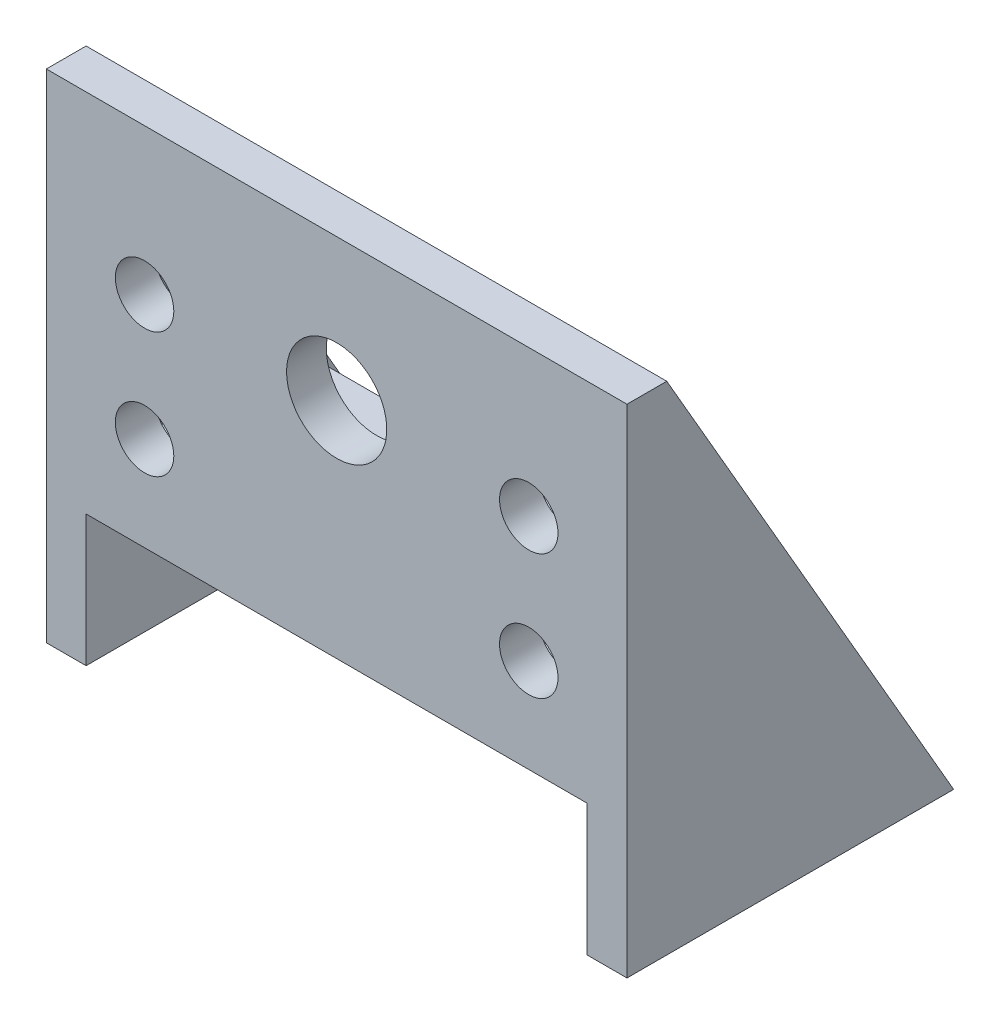
ISO-10303-21;
HEADER;
FILE_DESCRIPTION(('STEP AP214'),'2;1');
FILE_NAME('part.step','',(''),(''),'','','');
FILE_SCHEMA(('AUTOMOTIVE_DESIGN { 1 0 10303 214 1 1 1 1 }'));
ENDSEC;
DATA;
#1=APPLICATION_CONTEXT('core data for automotive mechanical design processes');
#2=APPLICATION_PROTOCOL_DEFINITION('international standard','automotive_design',2000,#1);
#3=PRODUCT_CONTEXT('',#1,'mechanical');
#4=PRODUCT('Part','Part','',(#3));
#5=PRODUCT_RELATED_PRODUCT_CATEGORY('part','',(#4));
#6=PRODUCT_DEFINITION_FORMATION('','',#4);
#7=PRODUCT_DEFINITION_CONTEXT('part definition',#1,'design');
#8=PRODUCT_DEFINITION('design','',#6,#7);
#9=PRODUCT_DEFINITION_SHAPE('','',#8);
#10=(LENGTH_UNIT() NAMED_UNIT(*) SI_UNIT(.MILLI.,.METRE.));
#11=(NAMED_UNIT(*) PLANE_ANGLE_UNIT() SI_UNIT($,.RADIAN.));
#12=(NAMED_UNIT(*) SI_UNIT($,.STERADIAN.) SOLID_ANGLE_UNIT());
#13=UNCERTAINTY_MEASURE_WITH_UNIT(LENGTH_MEASURE(1.E-05),#10,'distance_accuracy_value','');
#14=(GEOMETRIC_REPRESENTATION_CONTEXT(3) GLOBAL_UNCERTAINTY_ASSIGNED_CONTEXT((#13)) GLOBAL_UNIT_ASSIGNED_CONTEXT((#10,
#11,#12)) REPRESENTATION_CONTEXT('',''));
#15=CARTESIAN_POINT('',(0.,0.,0.));
#16=DIRECTION('',(0.,0.,1.));
#17=DIRECTION('',(1.,0.,0.));
#18=AXIS2_PLACEMENT_3D('',#15,#16,#17);
#19=CARTESIAN_POINT('',(0.,0.,4.7625));
#20=DIRECTION('',(0.,0.,1.));
#21=DIRECTION('',(1.,0.,0.));
#22=AXIS2_PLACEMENT_3D('',#19,#20,#21);
#23=PLANE('',#22);
#24=CARTESIAN_POINT('',(-30.7093483331857,-24.4339622641509,4.7625));
#25=DIRECTION('',(0.,0.,1.));
#26=DIRECTION('',(1.,0.,0.));
#27=AXIS2_PLACEMENT_3D('',#24,#25,#26);
#28=CIRCLE('',#27,3.5);
#29=CARTESIAN_POINT('',(-27.2093483331857,-24.4339622641509,4.7625));
#30=VERTEX_POINT('',#29);
#31=EDGE_CURVE('E375',#30,#30,#28,.T.);
#32=ORIENTED_EDGE('',*,*,#31,.F.);
#33=EDGE_LOOP('',(#32));
#34=FACE_BOUND('',#33,.T.);
#35=CARTESIAN_POINT('',(15.2906516668143,-24.4339622641509,4.7625));
#36=DIRECTION('',(0.,0.,1.));
#37=DIRECTION('',(1.,0.,0.));
#38=AXIS2_PLACEMENT_3D('',#35,#36,#37);
#39=CIRCLE('',#38,3.5);
#40=CARTESIAN_POINT('',(18.7906516668143,-24.4339622641509,4.7625));
#41=VERTEX_POINT('',#40);
#42=EDGE_CURVE('E379',#41,#41,#39,.T.);
#43=ORIENTED_EDGE('',*,*,#42,.F.);
#44=EDGE_LOOP('',(#43));
#45=FACE_BOUND('',#44,.T.);
#46=CARTESIAN_POINT('',(15.2906516668143,-9.43396226415094,4.7625));
#47=DIRECTION('',(0.,0.,1.));
#48=DIRECTION('',(1.,0.,0.));
#49=AXIS2_PLACEMENT_3D('',#46,#47,#48);
#50=CIRCLE('',#49,3.5);
#51=CARTESIAN_POINT('',(18.7906516668143,-9.43396226415094,4.7625));
#52=VERTEX_POINT('',#51);
#53=EDGE_CURVE('E374',#52,#52,#50,.T.);
#54=ORIENTED_EDGE('',*,*,#53,.F.);
#55=EDGE_LOOP('',(#54));
#56=FACE_BOUND('',#55,.T.);
#57=CARTESIAN_POINT('',(-30.7093483331857,-9.43396226415094,4.7625));
#58=DIRECTION('',(0.,0.,1.));
#59=DIRECTION('',(1.,0.,0.));
#60=AXIS2_PLACEMENT_3D('',#57,#58,#59);
#61=CIRCLE('',#60,3.5);
#62=CARTESIAN_POINT('',(-27.2093483331857,-9.43396226415094,4.7625));
#63=VERTEX_POINT('',#62);
#64=EDGE_CURVE('E262',#63,#63,#61,.T.);
#65=ORIENTED_EDGE('',*,*,#64,.F.);
#66=EDGE_LOOP('',(#65));
#67=FACE_BOUND('',#66,.T.);
#68=DIRECTION('',(1.,0.,0.));
#69=VECTOR('',#68,1.);
#70=CARTESIAN_POINT('',(-37.7093483331857,-35.6964622641509,4.7625));
#71=LINE('',#70,#69);
#72=CARTESIAN_POINT('',(-37.7093483331857,-35.6964622641509,4.7625));
#73=VERTEX_POINT('',#72);
#74=CARTESIAN_POINT('',(22.2906516668143,-35.6964622641509,4.7625));
#75=VERTEX_POINT('',#74);
#76=EDGE_CURVE('E130',#73,#75,#71,.T.);
#77=ORIENTED_EDGE('',*,*,#76,.T.);
#78=DIRECTION('',(0.,-1.,0.));
#79=VECTOR('',#78,1.);
#80=CARTESIAN_POINT('',(22.2906516668143,8.06603773584906,4.7625));
#81=LINE('',#80,#79);
#82=CARTESIAN_POINT('',(22.2906516668143,-51.4339622641509,4.7625));
#83=VERTEX_POINT('',#82);
#84=EDGE_CURVE('E195',#75,#83,#81,.T.);
#85=ORIENTED_EDGE('',*,*,#84,.T.);
#86=DIRECTION('',(-1.,0.,0.));
#87=VECTOR('',#86,1.);
#88=CARTESIAN_POINT('',(27.0531516668143,-51.4339622641509,4.7625));
#89=LINE('',#88,#87);
#90=CARTESIAN_POINT('',(27.0531516668143,-51.4339622641509,4.7625));
#91=VERTEX_POINT('',#90);
#92=EDGE_CURVE('E231',#91,#83,#89,.T.);
#93=ORIENTED_EDGE('',*,*,#92,.F.);
#94=DIRECTION('',(0.,-1.,0.));
#95=VECTOR('',#94,1.);
#96=CARTESIAN_POINT('',(27.0531516668143,8.06603773584906,4.7625));
#97=LINE('',#96,#95);
#98=CARTESIAN_POINT('',(27.0531516668143,8.06603773584906,4.7625));
#99=VERTEX_POINT('',#98);
#100=EDGE_CURVE('E205',#99,#91,#97,.T.);
#101=ORIENTED_EDGE('',*,*,#100,.F.);
#102=DIRECTION('',(-1.,0.,0.));
#103=VECTOR('',#102,1.);
#104=CARTESIAN_POINT('',(-37.7093483331857,8.06603773584906,4.7625));
#105=LINE('',#104,#103);
#106=CARTESIAN_POINT('',(-42.4718483331857,8.06603773584906,4.7625));
#107=VERTEX_POINT('',#106);
#108=EDGE_CURVE('E11',#99,#107,#105,.T.);
#109=ORIENTED_EDGE('',*,*,#108,.T.);
#110=DIRECTION('',(0.,-1.,0.));
#111=VECTOR('',#110,1.);
#112=CARTESIAN_POINT('',(-42.4718483331857,8.06603773584906,4.7625));
#113=LINE('',#112,#111);
#114=CARTESIAN_POINT('',(-42.4718483331857,-51.4339622641509,4.7625));
#115=VERTEX_POINT('',#114);
#116=EDGE_CURVE('E171',#107,#115,#113,.T.);
#117=ORIENTED_EDGE('',*,*,#116,.T.);
#118=DIRECTION('',(1.,0.,0.));
#119=VECTOR('',#118,1.);
#120=CARTESIAN_POINT('',(-42.4718483331857,-51.4339622641509,4.7625));
#121=LINE('',#120,#119);
#122=CARTESIAN_POINT('',(-37.7093483331857,-51.4339622641509,4.7625));
#123=VERTEX_POINT('',#122);
#124=EDGE_CURVE('E132',#115,#123,#121,.T.);
#125=ORIENTED_EDGE('',*,*,#124,.T.);
#126=DIRECTION('',(0.,-1.,0.));
#127=VECTOR('',#126,1.);
#128=CARTESIAN_POINT('',(-37.7093483331857,8.06603773584906,4.7625));
#129=LINE('',#128,#127);
#130=EDGE_CURVE('E126',#73,#123,#129,.T.);
#131=ORIENTED_EDGE('',*,*,#130,.F.);
#132=EDGE_LOOP('',(#77,#85,#93,#101,#109,#117,#125,#131));
#133=FACE_BOUND('',#132,.T.);
#134=CARTESIAN_POINT('',(-7.70934833318569,-8.93396226415094,4.7625));
#135=DIRECTION('',(0.,0.,1.));
#136=DIRECTION('',(1.,0.,0.));
#137=AXIS2_PLACEMENT_3D('',#134,#135,#136);
#138=CIRCLE('',#137,6.);
#139=CARTESIAN_POINT('',(-13.7093483331857,-8.93396226415094,4.7625));
#140=VERTEX_POINT('',#139);
#141=EDGE_CURVE('E236',#140,#140,#138,.T.);
#142=ORIENTED_EDGE('',*,*,#141,.F.);
#143=EDGE_LOOP('',(#142));
#144=FACE_BOUND('',#143,.T.);
#145=ADVANCED_FACE('F43',(#34,#45,#56,#67,#133,#144),#23,.T.);
#146=CARTESIAN_POINT('',(0.,0.,0.));
#147=DIRECTION('',(0.,0.,1.));
#148=DIRECTION('',(1.,0.,0.));
#149=AXIS2_PLACEMENT_3D('',#146,#147,#148);
#150=PLANE('',#149);
#151=CARTESIAN_POINT('',(-30.7093483331857,-24.4339622641509,0.));
#152=DIRECTION('',(0.,0.,1.));
#153=DIRECTION('',(1.,0.,0.));
#154=AXIS2_PLACEMENT_3D('',#151,#152,#153);
#155=CIRCLE('',#154,3.5);
#156=CARTESIAN_POINT('',(-27.2093483331857,-24.4339622641509,0.));
#157=VERTEX_POINT('',#156);
#158=EDGE_CURVE('E47',#157,#157,#155,.T.);
#159=ORIENTED_EDGE('',*,*,#158,.T.);
#160=EDGE_LOOP('',(#159));
#161=FACE_BOUND('',#160,.T.);
#162=CARTESIAN_POINT('',(15.2906516668143,-24.4339622641509,0.));
#163=DIRECTION('',(0.,0.,1.));
#164=DIRECTION('',(1.,0.,0.));
#165=AXIS2_PLACEMENT_3D('',#162,#163,#164);
#166=CIRCLE('',#165,3.5);
#167=CARTESIAN_POINT('',(18.7906516668143,-24.4339622641509,0.));
#168=VERTEX_POINT('',#167);
#169=EDGE_CURVE('E159',#168,#168,#166,.T.);
#170=ORIENTED_EDGE('',*,*,#169,.T.);
#171=EDGE_LOOP('',(#170));
#172=FACE_BOUND('',#171,.T.);
#173=CARTESIAN_POINT('',(15.2906516668143,-9.43396226415094,0.));
#174=DIRECTION('',(0.,0.,1.));
#175=DIRECTION('',(1.,0.,0.));
#176=AXIS2_PLACEMENT_3D('',#173,#174,#175);
#177=CIRCLE('',#176,3.5);
#178=CARTESIAN_POINT('',(18.7906516668143,-9.43396226415094,0.));
#179=VERTEX_POINT('',#178);
#180=EDGE_CURVE('E261',#179,#179,#177,.T.);
#181=ORIENTED_EDGE('',*,*,#180,.T.);
#182=EDGE_LOOP('',(#181));
#183=FACE_BOUND('',#182,.T.);
#184=CARTESIAN_POINT('',(-30.7093483331857,-9.43396226415094,0.));
#185=DIRECTION('',(0.,0.,1.));
#186=DIRECTION('',(1.,0.,0.));
#187=AXIS2_PLACEMENT_3D('',#184,#185,#186);
#188=CIRCLE('',#187,3.5);
#189=CARTESIAN_POINT('',(-27.2093483331857,-9.43396226415094,0.));
#190=VERTEX_POINT('',#189);
#191=EDGE_CURVE('E257',#190,#190,#188,.T.);
#192=ORIENTED_EDGE('',*,*,#191,.T.);
#193=EDGE_LOOP('',(#192));
#194=FACE_BOUND('',#193,.T.);
#195=DIRECTION('',(0.,-1.,0.));
#196=VECTOR('',#195,1.);
#197=CARTESIAN_POINT('',(-37.7093483331857,8.06603773584906,0.));
#198=LINE('',#197,#196);
#199=CARTESIAN_POINT('',(-37.7093483331857,8.06603773584906,0.));
#200=VERTEX_POINT('',#199);
#201=CARTESIAN_POINT('',(-37.7093483331857,-30.9339622641509,0.));
#202=VERTEX_POINT('',#201);
#203=EDGE_CURVE('E240',#200,#202,#198,.T.);
#204=ORIENTED_EDGE('',*,*,#203,.F.);
#205=DIRECTION('',(-1.,0.,0.));
#206=VECTOR('',#205,1.);
#207=CARTESIAN_POINT('',(-37.7093483331857,8.06603773584906,0.));
#208=LINE('',#207,#206);
#209=CARTESIAN_POINT('',(22.2906516668143,8.06603773584906,0.));
#210=VERTEX_POINT('',#209);
#211=EDGE_CURVE('E53',#210,#200,#208,.T.);
#212=ORIENTED_EDGE('',*,*,#211,.F.);
#213=DIRECTION('',(0.,1.,0.));
#214=VECTOR('',#213,1.);
#215=CARTESIAN_POINT('',(22.2906516668143,8.06603773584906,0.));
#216=LINE('',#215,#214);
#217=CARTESIAN_POINT('',(22.2906516668143,-30.9339622641509,0.));
#218=VERTEX_POINT('',#217);
#219=EDGE_CURVE('E250',#218,#210,#216,.T.);
#220=ORIENTED_EDGE('',*,*,#219,.F.);
#221=DIRECTION('',(1.,0.,0.));
#222=VECTOR('',#221,1.);
#223=CARTESIAN_POINT('',(-37.7093483331857,-30.9339622641509,0.));
#224=LINE('',#223,#222);
#225=EDGE_CURVE('E246',#202,#218,#224,.T.);
#226=ORIENTED_EDGE('',*,*,#225,.F.);
#227=EDGE_LOOP('',(#204,#212,#220,#226));
#228=FACE_BOUND('',#227,.T.);
#229=CARTESIAN_POINT('',(-7.70934833318569,-8.93396226415094,0.));
#230=DIRECTION('',(0.,0.,1.));
#231=DIRECTION('',(1.,0.,0.));
#232=AXIS2_PLACEMENT_3D('',#229,#230,#231);
#233=CIRCLE('',#232,6.);
#234=CARTESIAN_POINT('',(-13.7093483331857,-8.93396226415094,0.));
#235=VERTEX_POINT('',#234);
#236=EDGE_CURVE('E235',#235,#235,#233,.T.);
#237=ORIENTED_EDGE('',*,*,#236,.T.);
#238=EDGE_LOOP('',(#237));
#239=FACE_BOUND('',#238,.T.);
#240=ADVANCED_FACE('F269',(#161,#172,#183,#194,#228,#239),#150,.F.);
#241=CARTESIAN_POINT('',(-37.7093483331857,8.06603773584906,4.7625));
#242=DIRECTION('',(0.,-1.,0.));
#243=DIRECTION('',(0.,0.,-1.));
#244=AXIS2_PLACEMENT_3D('',#241,#242,#243);
#245=PLANE('',#244);
#246=ORIENTED_EDGE('',*,*,#211,.T.);
#247=DIRECTION('',(1.,0.,0.));
#248=VECTOR('',#247,1.);
#249=CARTESIAN_POINT('',(-42.4718483331857,8.06603773584906,0.));
#250=LINE('',#249,#248);
#251=CARTESIAN_POINT('',(-42.4718483331857,8.06603773584906,0.));
#252=VERTEX_POINT('',#251);
#253=EDGE_CURVE('E192',#252,#200,#250,.T.);
#254=ORIENTED_EDGE('',*,*,#253,.F.);
#255=DIRECTION('',(0.,0.,1.));
#256=VECTOR('',#255,1.);
#257=CARTESIAN_POINT('',(-42.4718483331857,8.06603773584906,4.7625));
#258=LINE('',#257,#256);
#259=EDGE_CURVE('E183',#252,#107,#258,.T.);
#260=ORIENTED_EDGE('',*,*,#259,.T.);
#261=ORIENTED_EDGE('',*,*,#108,.F.);
#262=DIRECTION('',(0.,0.,1.));
#263=VECTOR('',#262,1.);
#264=CARTESIAN_POINT('',(27.0531516668143,8.06603773584906,0.));
#265=LINE('',#264,#263);
#266=CARTESIAN_POINT('',(27.0531516668143,8.06603773584906,0.));
#267=VERTEX_POINT('',#266);
#268=EDGE_CURVE('E201',#267,#99,#265,.T.);
#269=ORIENTED_EDGE('',*,*,#268,.F.);
#270=DIRECTION('',(-1.,0.,0.));
#271=VECTOR('',#270,1.);
#272=CARTESIAN_POINT('',(27.0531516668143,8.06603773584906,0.));
#273=LINE('',#272,#271);
#274=EDGE_CURVE('E215',#267,#210,#273,.T.);
#275=ORIENTED_EDGE('',*,*,#274,.T.);
#276=EDGE_LOOP('',(#246,#254,#260,#261,#269,#275));
#277=FACE_BOUND('',#276,.T.);
#278=ADVANCED_FACE('F45',(#277),#245,.F.);
#279=CARTESIAN_POINT('',(-7.70934833318569,-8.93396226415094,4.7625));
#280=DIRECTION('',(0.,0.,-1.));
#281=DIRECTION('',(-1.,0.,0.));
#282=AXIS2_PLACEMENT_3D('',#279,#280,#281);
#283=CYLINDRICAL_SURFACE('',#282,6.);
#284=CARTESIAN_POINT('',(-13.7093483331857,-8.93396226415094,4.7625));
#285=CARTESIAN_POINT('',(-13.7093483331857,-8.93396226415094,4.712890625));
#286=CARTESIAN_POINT('',(-13.7093483331857,-8.93396226415094,4.66328125));
#287=CARTESIAN_POINT('',(-13.7093483331857,-8.93396226415094,4.5640625));
#288=CARTESIAN_POINT('',(-13.7093483331857,-8.93396226415094,4.514453125));
#289=CARTESIAN_POINT('',(-13.7093483331857,-8.93396226415094,4.415234375));
#290=CARTESIAN_POINT('',(-13.7093483331857,-8.93396226415094,4.365625));
#291=CARTESIAN_POINT('',(-13.7093483331857,-8.93396226415094,4.26640625));
#292=CARTESIAN_POINT('',(-13.7093483331857,-8.93396226415094,4.216796875));
#293=CARTESIAN_POINT('',(-13.7093483331857,-8.93396226415094,4.117578125));
#294=CARTESIAN_POINT('',(-13.7093483331857,-8.93396226415094,4.06796875));
#295=CARTESIAN_POINT('',(-13.7093483331857,-8.93396226415094,3.96875));
#296=CARTESIAN_POINT('',(-13.7093483331857,-8.93396226415094,3.919140625));
#297=CARTESIAN_POINT('',(-13.7093483331857,-8.93396226415094,3.819921875));
#298=CARTESIAN_POINT('',(-13.7093483331857,-8.93396226415094,3.7703125));
#299=CARTESIAN_POINT('',(-13.7093483331857,-8.93396226415094,3.67109375));
#300=CARTESIAN_POINT('',(-13.7093483331857,-8.93396226415094,3.621484375));
#301=CARTESIAN_POINT('',(-13.7093483331857,-8.93396226415094,3.522265625));
#302=CARTESIAN_POINT('',(-13.7093483331857,-8.93396226415094,3.47265625));
#303=CARTESIAN_POINT('',(-13.7093483331857,-8.93396226415094,3.3734375));
#304=CARTESIAN_POINT('',(-13.7093483331857,-8.93396226415094,3.323828125));
#305=CARTESIAN_POINT('',(-13.7093483331857,-8.93396226415094,3.224609375));
#306=CARTESIAN_POINT('',(-13.7093483331857,-8.93396226415094,3.175));
#307=CARTESIAN_POINT('',(-13.7093483331857,-8.93396226415094,3.07578125));
#308=CARTESIAN_POINT('',(-13.7093483331857,-8.93396226415094,3.026171875));
#309=CARTESIAN_POINT('',(-13.7093483331857,-8.93396226415094,2.926953125));
#310=CARTESIAN_POINT('',(-13.7093483331857,-8.93396226415094,2.87734375));
#311=CARTESIAN_POINT('',(-13.7093483331857,-8.93396226415094,2.778125));
#312=CARTESIAN_POINT('',(-13.7093483331857,-8.93396226415094,2.728515625));
#313=CARTESIAN_POINT('',(-13.7093483331857,-8.93396226415094,2.629296875));
#314=CARTESIAN_POINT('',(-13.7093483331857,-8.93396226415094,2.5796875));
#315=CARTESIAN_POINT('',(-13.7093483331857,-8.93396226415094,2.48046875));
#316=CARTESIAN_POINT('',(-13.7093483331857,-8.93396226415094,2.430859375));
#317=CARTESIAN_POINT('',(-13.7093483331857,-8.93396226415094,2.331640625));
#318=CARTESIAN_POINT('',(-13.7093483331857,-8.93396226415094,2.28203125));
#319=CARTESIAN_POINT('',(-13.7093483331857,-8.93396226415094,2.1828125));
#320=CARTESIAN_POINT('',(-13.7093483331857,-8.93396226415094,2.133203125));
#321=CARTESIAN_POINT('',(-13.7093483331857,-8.93396226415094,2.033984375));
#322=CARTESIAN_POINT('',(-13.7093483331857,-8.93396226415094,1.984375));
#323=CARTESIAN_POINT('',(-13.7093483331857,-8.93396226415094,1.88515625));
#324=CARTESIAN_POINT('',(-13.7093483331857,-8.93396226415094,1.835546875));
#325=CARTESIAN_POINT('',(-13.7093483331857,-8.93396226415094,1.736328125));
#326=CARTESIAN_POINT('',(-13.7093483331857,-8.93396226415094,1.68671875));
#327=CARTESIAN_POINT('',(-13.7093483331857,-8.93396226415094,1.5875));
#328=CARTESIAN_POINT('',(-13.7093483331857,-8.93396226415094,1.537890625));
#329=CARTESIAN_POINT('',(-13.7093483331857,-8.93396226415094,1.438671875));
#330=CARTESIAN_POINT('',(-13.7093483331857,-8.93396226415094,1.3890625));
#331=CARTESIAN_POINT('',(-13.7093483331857,-8.93396226415094,1.28984375));
#332=CARTESIAN_POINT('',(-13.7093483331857,-8.93396226415094,1.240234375));
#333=CARTESIAN_POINT('',(-13.7093483331857,-8.93396226415094,1.141015625));
#334=CARTESIAN_POINT('',(-13.7093483331857,-8.93396226415094,1.09140625));
#335=CARTESIAN_POINT('',(-13.7093483331857,-8.93396226415094,0.992187499999999));
#336=CARTESIAN_POINT('',(-13.7093483331857,-8.93396226415094,0.942578124999999));
#337=CARTESIAN_POINT('',(-13.7093483331857,-8.93396226415094,0.843359375));
#338=CARTESIAN_POINT('',(-13.7093483331857,-8.93396226415094,0.79375));
#339=CARTESIAN_POINT('',(-13.7093483331857,-8.93396226415094,0.69453125));
#340=CARTESIAN_POINT('',(-13.7093483331857,-8.93396226415094,0.644921875));
#341=CARTESIAN_POINT('',(-13.7093483331857,-8.93396226415094,0.545703125));
#342=CARTESIAN_POINT('',(-13.7093483331857,-8.93396226415094,0.49609375));
#343=CARTESIAN_POINT('',(-13.7093483331857,-8.93396226415094,0.396875));
#344=CARTESIAN_POINT('',(-13.7093483331857,-8.93396226415094,0.347265625));
#345=CARTESIAN_POINT('',(-13.7093483331857,-8.93396226415094,0.248046875));
#346=CARTESIAN_POINT('',(-13.7093483331857,-8.93396226415094,0.1984375));
#347=CARTESIAN_POINT('',(-13.7093483331857,-8.93396226415094,0.09921875));
#348=CARTESIAN_POINT('',(-13.7093483331857,-8.93396226415094,0.049609375));
#349=CARTESIAN_POINT('',(-13.7093483331857,-8.93396226415094,0.));
#350=B_SPLINE_CURVE_WITH_KNOTS('',3,(#284,#285,#286,#287,#288,#289,#290,#291,#292,#293,#294,
#295,#296,#297,#298,#299,#300,#301,#302,#303,#304,#305,#306,#307,#308,#309,#310,#311,#312,#313,
#314,#315,#316,#317,#318,#319,#320,#321,#322,#323,#324,#325,#326,#327,#328,#329,#330,#331,#332,
#333,#334,#335,#336,#337,#338,#339,#340,#341,#342,#343,#344,#345,#346,#347,#348,#349),
.UNSPECIFIED.,.F.,.F.,(4,2,2,2,2,2,2,2,2,2,2,2,2,2,2,2,2,2,2,2,2,2,2,2,2,2,2,2,2,2,2,2,4),(0.,
0.148828125,0.29765625,0.446484375,0.5953125,0.744140625,0.892968750000001,1.041796875,1.190625,
1.339453125,1.48828125,1.637109375,1.7859375,1.934765625,2.08359375,2.232421875,2.38125,
2.530078125,2.67890625,2.827734375,2.9765625,3.125390625,3.27421875,3.423046875,3.571875,
3.720703125,3.86953125,4.018359375,4.1671875,4.316015625,4.46484375,4.613671875,4.7625),.UNSPECIFIED.);
#351=EDGE_CURVE('BSEAM298',#140,#235,#350,.T.);
#352=ORIENTED_EDGE('',*,*,#141,.T.);
#353=ORIENTED_EDGE('',*,*,#236,.F.);
#354=ORIENTED_EDGE('',*,*,#351,.T.);
#355=ORIENTED_EDGE('',*,*,#351,.F.);
#356=EDGE_LOOP('',(#352,#354,#353,#355));
#357=FACE_BOUND('',#356,.T.);
#358=ADVANCED_FACE('F298',(#357),#283,.F.);
#359=CARTESIAN_POINT('',(22.2906516668143,0.,0.));
#360=DIRECTION('',(1.,0.,0.));
#361=DIRECTION('',(0.,0.,-1.));
#362=AXIS2_PLACEMENT_3D('',#359,#360,#361);
#363=PLANE('',#362);
#364=DIRECTION('',(0.,1.,0.));
#365=VECTOR('',#364,1.);
#366=CARTESIAN_POINT('',(22.2906516668143,-30.9339622641509,-20.2375));
#367=LINE('',#366,#365);
#368=CARTESIAN_POINT('',(22.2906516668143,-35.6964622641509,-20.2375));
#369=VERTEX_POINT('',#368);
#370=CARTESIAN_POINT('',(22.2906516668143,-30.9339622641509,-20.2375));
#371=VERTEX_POINT('',#370);
#372=EDGE_CURVE('E65',#369,#371,#367,.T.);
#373=ORIENTED_EDGE('',*,*,#372,.T.);
#374=DIRECTION('',(0.,0.,1.));
#375=VECTOR('',#374,1.);
#376=CARTESIAN_POINT('',(22.2906516668143,-30.9339622641509,-20.2375));
#377=LINE('',#376,#375);
#378=EDGE_CURVE('E166',#371,#218,#377,.T.);
#379=ORIENTED_EDGE('',*,*,#378,.T.);
#380=ORIENTED_EDGE('',*,*,#219,.T.);
#381=DIRECTION('',(0.,0.866025403784436,0.500000000000004));
#382=VECTOR('',#381,1.);
#383=CARTESIAN_POINT('',(22.2906516668143,-51.4339622641509,-34.3523410167831));
#384=LINE('',#383,#382);
#385=CARTESIAN_POINT('',(22.2906516668143,-51.4339622641509,-34.3523410167831));
#386=VERTEX_POINT('',#385);
#387=EDGE_CURVE('E206',#386,#210,#384,.T.);
#388=ORIENTED_EDGE('',*,*,#387,.F.);
#389=DIRECTION('',(0.,0.,-1.));
#390=VECTOR('',#389,1.);
#391=CARTESIAN_POINT('',(22.2906516668143,-51.4339622641509,4.7625));
#392=LINE('',#391,#390);
#393=EDGE_CURVE('E218',#83,#386,#392,.T.);
#394=ORIENTED_EDGE('',*,*,#393,.F.);
#395=ORIENTED_EDGE('',*,*,#84,.F.);
#396=DIRECTION('',(0.,0.,1.));
#397=VECTOR('',#396,1.);
#398=CARTESIAN_POINT('',(22.2906516668143,-35.6964622641509,-20.2375));
#399=LINE('',#398,#397);
#400=EDGE_CURVE('E61',#369,#75,#399,.T.);
#401=ORIENTED_EDGE('',*,*,#400,.F.);
#402=EDGE_LOOP('',(#373,#379,#380,#388,#394,#395,#401));
#403=FACE_BOUND('',#402,.T.);
#404=ADVANCED_FACE('F301',(#403),#363,.F.);
#405=CARTESIAN_POINT('',(27.0531516668143,-51.4339622641509,4.7625));
#406=DIRECTION('',(0.,1.,0.));
#407=DIRECTION('',(0.,0.,1.));
#408=AXIS2_PLACEMENT_3D('',#405,#406,#407);
#409=PLANE('',#408);
#410=ORIENTED_EDGE('',*,*,#393,.T.);
#411=DIRECTION('',(-1.,0.,0.));
#412=VECTOR('',#411,1.);
#413=CARTESIAN_POINT('',(27.0531516668143,-51.4339622641509,-34.3523410167831));
#414=LINE('',#413,#412);
#415=CARTESIAN_POINT('',(27.0531516668143,-51.4339622641509,-34.3523410167831));
#416=VERTEX_POINT('',#415);
#417=EDGE_CURVE('E227',#416,#386,#414,.T.);
#418=ORIENTED_EDGE('',*,*,#417,.F.);
#419=DIRECTION('',(0.,0.,-1.));
#420=VECTOR('',#419,1.);
#421=CARTESIAN_POINT('',(27.0531516668143,-51.4339622641509,4.7625));
#422=LINE('',#421,#420);
#423=EDGE_CURVE('E209',#91,#416,#422,.T.);
#424=ORIENTED_EDGE('',*,*,#423,.F.);
#425=ORIENTED_EDGE('',*,*,#92,.T.);
#426=EDGE_LOOP('',(#410,#418,#424,#425));
#427=FACE_BOUND('',#426,.T.);
#428=ADVANCED_FACE('F303',(#427),#409,.F.);
#429=CARTESIAN_POINT('',(27.0531516668143,-51.4339622641509,-34.3523410167831));
#430=DIRECTION('',(0.,-0.500000000000004,0.866025403784436));
#431=DIRECTION('',(0.,-0.866025403784436,-0.500000000000004));
#432=AXIS2_PLACEMENT_3D('',#429,#430,#431);
#433=PLANE('',#432);
#434=ORIENTED_EDGE('',*,*,#387,.T.);
#435=ORIENTED_EDGE('',*,*,#274,.F.);
#436=DIRECTION('',(0.,0.866025403784436,0.500000000000004));
#437=VECTOR('',#436,1.);
#438=CARTESIAN_POINT('',(27.0531516668143,-51.4339622641509,-34.3523410167831));
#439=LINE('',#438,#437);
#440=EDGE_CURVE('E212',#416,#267,#439,.T.);
#441=ORIENTED_EDGE('',*,*,#440,.F.);
#442=ORIENTED_EDGE('',*,*,#417,.T.);
#443=EDGE_LOOP('',(#434,#435,#441,#442));
#444=FACE_BOUND('',#443,.T.);
#445=ADVANCED_FACE('F306',(#444),#433,.F.);
#446=CARTESIAN_POINT('',(27.0531516668143,0.,0.));
#447=DIRECTION('',(1.,0.,0.));
#448=DIRECTION('',(0.,0.,-1.));
#449=AXIS2_PLACEMENT_3D('',#446,#447,#448);
#450=PLANE('',#449);
#451=ORIENTED_EDGE('',*,*,#268,.T.);
#452=ORIENTED_EDGE('',*,*,#100,.T.);
#453=ORIENTED_EDGE('',*,*,#423,.T.);
#454=ORIENTED_EDGE('',*,*,#440,.T.);
#455=EDGE_LOOP('',(#451,#452,#453,#454));
#456=FACE_BOUND('',#455,.T.);
#457=ADVANCED_FACE('F310',(#456),#450,.T.);
#458=CARTESIAN_POINT('',(-42.4718483331857,10.1282607286108,1.19062500000002));
#459=DIRECTION('',(0.,0.500000000000004,-0.866025403784436));
#460=DIRECTION('',(0.,0.866025403784436,0.500000000000004));
#461=AXIS2_PLACEMENT_3D('',#458,#459,#460);
#462=PLANE('',#461);
#463=DIRECTION('',(0.,0.866025403784436,0.500000000000004));
#464=VECTOR('',#463,1.);
#465=CARTESIAN_POINT('',(-37.7093483331857,10.1282607286108,1.19062500000002));
#466=LINE('',#465,#464);
#467=CARTESIAN_POINT('',(-37.7093483331857,-51.4339622641509,-34.3523410167831));
#468=VERTEX_POINT('',#467);
#469=EDGE_CURVE('E175',#468,#200,#466,.T.);
#470=ORIENTED_EDGE('',*,*,#469,.F.);
#471=DIRECTION('',(1.,0.,0.));
#472=VECTOR('',#471,1.);
#473=CARTESIAN_POINT('',(-42.4718483331857,-51.4339622641509,-34.3523410167831));
#474=LINE('',#473,#472);
#475=CARTESIAN_POINT('',(-42.4718483331857,-51.4339622641509,-34.3523410167831));
#476=VERTEX_POINT('',#475);
#477=EDGE_CURVE('E196',#476,#468,#474,.T.);
#478=ORIENTED_EDGE('',*,*,#477,.F.);
#479=DIRECTION('',(0.,0.866025403784436,0.500000000000004));
#480=VECTOR('',#479,1.);
#481=CARTESIAN_POINT('',(-42.4718483331857,10.1282607286108,1.19062500000002));
#482=LINE('',#481,#480);
#483=EDGE_CURVE('E179',#476,#252,#482,.T.);
#484=ORIENTED_EDGE('',*,*,#483,.T.);
#485=ORIENTED_EDGE('',*,*,#253,.T.);
#486=EDGE_LOOP('',(#470,#478,#484,#485));
#487=FACE_BOUND('',#486,.T.);
#488=ADVANCED_FACE('F316',(#487),#462,.T.);
#489=CARTESIAN_POINT('',(-42.4718483331857,-51.4339622641509,4.7625));
#490=DIRECTION('',(0.,-1.,0.));
#491=DIRECTION('',(0.,0.,-1.));
#492=AXIS2_PLACEMENT_3D('',#489,#490,#491);
#493=PLANE('',#492);
#494=DIRECTION('',(0.,0.,-1.));
#495=VECTOR('',#494,1.);
#496=CARTESIAN_POINT('',(-37.7093483331857,-51.4339622641509,4.7625));
#497=LINE('',#496,#495);
#498=EDGE_CURVE('E137',#123,#468,#497,.T.);
#499=ORIENTED_EDGE('',*,*,#498,.F.);
#500=ORIENTED_EDGE('',*,*,#124,.F.);
#501=DIRECTION('',(0.,0.,-1.));
#502=VECTOR('',#501,1.);
#503=CARTESIAN_POINT('',(-42.4718483331857,-51.4339622641509,4.7625));
#504=LINE('',#503,#502);
#505=EDGE_CURVE('E174',#115,#476,#504,.T.);
#506=ORIENTED_EDGE('',*,*,#505,.T.);
#507=ORIENTED_EDGE('',*,*,#477,.T.);
#508=EDGE_LOOP('',(#499,#500,#506,#507));
#509=FACE_BOUND('',#508,.T.);
#510=ADVANCED_FACE('F318',(#509),#493,.T.);
#511=CARTESIAN_POINT('',(-42.4718483331857,0.,0.));
#512=DIRECTION('',(1.,0.,0.));
#513=DIRECTION('',(0.,0.,-1.));
#514=AXIS2_PLACEMENT_3D('',#511,#512,#513);
#515=PLANE('',#514);
#516=ORIENTED_EDGE('',*,*,#116,.F.);
#517=ORIENTED_EDGE('',*,*,#259,.F.);
#518=ORIENTED_EDGE('',*,*,#483,.F.);
#519=ORIENTED_EDGE('',*,*,#505,.F.);
#520=EDGE_LOOP('',(#516,#517,#518,#519));
#521=FACE_BOUND('',#520,.T.);
#522=ADVANCED_FACE('F321',(#521),#515,.F.);
#523=CARTESIAN_POINT('',(-37.7093483331857,0.,0.));
#524=DIRECTION('',(1.,0.,0.));
#525=DIRECTION('',(0.,0.,-1.));
#526=AXIS2_PLACEMENT_3D('',#523,#524,#525);
#527=PLANE('',#526);
#528=DIRECTION('',(0.,0.,1.));
#529=VECTOR('',#528,1.);
#530=CARTESIAN_POINT('',(-37.7093483331857,-30.9339622641509,-20.2375));
#531=LINE('',#530,#529);
#532=CARTESIAN_POINT('',(-37.7093483331857,-30.9339622641509,-20.2375));
#533=VERTEX_POINT('',#532);
#534=EDGE_CURVE('E138',#533,#202,#531,.T.);
#535=ORIENTED_EDGE('',*,*,#534,.F.);
#536=DIRECTION('',(0.,-1.,0.));
#537=VECTOR('',#536,1.);
#538=CARTESIAN_POINT('',(-37.7093483331857,-30.9339622641509,-20.2375));
#539=LINE('',#538,#537);
#540=CARTESIAN_POINT('',(-37.7093483331857,-35.6964622641509,-20.2375));
#541=VERTEX_POINT('',#540);
#542=EDGE_CURVE('E144',#533,#541,#539,.T.);
#543=ORIENTED_EDGE('',*,*,#542,.T.);
#544=DIRECTION('',(0.,0.,1.));
#545=VECTOR('',#544,1.);
#546=CARTESIAN_POINT('',(-37.7093483331857,-35.6964622641509,-20.2375));
#547=LINE('',#546,#545);
#548=EDGE_CURVE('E141',#541,#73,#547,.T.);
#549=ORIENTED_EDGE('',*,*,#548,.T.);
#550=ORIENTED_EDGE('',*,*,#130,.T.);
#551=ORIENTED_EDGE('',*,*,#498,.T.);
#552=ORIENTED_EDGE('',*,*,#469,.T.);
#553=ORIENTED_EDGE('',*,*,#203,.T.);
#554=EDGE_LOOP('',(#535,#543,#549,#550,#551,#552,#553));
#555=FACE_BOUND('',#554,.T.);
#556=ADVANCED_FACE('F142',(#555),#527,.T.);
#557=CARTESIAN_POINT('',(-37.7093483331857,-30.9339622641509,-20.2375));
#558=DIRECTION('',(0.,1.,0.));
#559=DIRECTION('',(0.,0.,1.));
#560=AXIS2_PLACEMENT_3D('',#557,#558,#559);
#561=PLANE('',#560);
#562=ORIENTED_EDGE('',*,*,#225,.T.);
#563=ORIENTED_EDGE('',*,*,#378,.F.);
#564=DIRECTION('',(-1.,0.,0.));
#565=VECTOR('',#564,1.);
#566=CARTESIAN_POINT('',(-37.7093483331857,-30.9339622641509,-20.2375));
#567=LINE('',#566,#565);
#568=EDGE_CURVE('E149',#371,#533,#567,.T.);
#569=ORIENTED_EDGE('',*,*,#568,.T.);
#570=ORIENTED_EDGE('',*,*,#534,.T.);
#571=EDGE_LOOP('',(#562,#563,#569,#570));
#572=FACE_BOUND('',#571,.T.);
#573=ADVANCED_FACE('F328',(#572),#561,.T.);
#574=CARTESIAN_POINT('',(-37.7093483331857,-35.6964622641509,-20.2375));
#575=DIRECTION('',(0.,-1.,0.));
#576=DIRECTION('',(0.,0.,-1.));
#577=AXIS2_PLACEMENT_3D('',#574,#575,#576);
#578=PLANE('',#577);
#579=ORIENTED_EDGE('',*,*,#76,.F.);
#580=ORIENTED_EDGE('',*,*,#548,.F.);
#581=DIRECTION('',(1.,0.,0.));
#582=VECTOR('',#581,1.);
#583=CARTESIAN_POINT('',(-37.7093483331857,-35.6964622641509,-20.2375));
#584=LINE('',#583,#582);
#585=EDGE_CURVE('E156',#541,#369,#584,.T.);
#586=ORIENTED_EDGE('',*,*,#585,.T.);
#587=ORIENTED_EDGE('',*,*,#400,.T.);
#588=EDGE_LOOP('',(#579,#580,#586,#587));
#589=FACE_BOUND('',#588,.T.);
#590=ADVANCED_FACE('F151',(#589),#578,.T.);
#591=CARTESIAN_POINT('',(0.,0.,-20.2375));
#592=DIRECTION('',(0.,0.,1.));
#593=DIRECTION('',(1.,0.,0.));
#594=AXIS2_PLACEMENT_3D('',#591,#592,#593);
#595=PLANE('',#594);
#596=ORIENTED_EDGE('',*,*,#542,.F.);
#597=ORIENTED_EDGE('',*,*,#568,.F.);
#598=ORIENTED_EDGE('',*,*,#372,.F.);
#599=ORIENTED_EDGE('',*,*,#585,.F.);
#600=EDGE_LOOP('',(#596,#597,#598,#599));
#601=FACE_BOUND('',#600,.T.);
#602=ADVANCED_FACE('F334',(#601),#595,.F.);
#603=CARTESIAN_POINT('',(-30.7093483331857,-9.43396226415094,-5.2375));
#604=DIRECTION('',(0.,0.,1.));
#605=DIRECTION('',(1.,0.,0.));
#606=AXIS2_PLACEMENT_3D('',#603,#604,#605);
#607=CYLINDRICAL_SURFACE('',#606,3.5);
#608=ORIENTED_EDGE('',*,*,#64,.T.);
#609=EDGE_LOOP('',(#608));
#610=FACE_BOUND('',#609,.T.);
#611=ORIENTED_EDGE('',*,*,#191,.F.);
#612=EDGE_LOOP('',(#611));
#613=FACE_BOUND('',#612,.T.);
#614=ADVANCED_FACE('F284',(#610,#613),#607,.F.);
#615=CARTESIAN_POINT('',(15.2906516668143,-9.43396226415094,-5.2375));
#616=DIRECTION('',(0.,0.,1.));
#617=DIRECTION('',(1.,0.,0.));
#618=AXIS2_PLACEMENT_3D('',#615,#616,#617);
#619=CYLINDRICAL_SURFACE('',#618,3.5);
#620=ORIENTED_EDGE('',*,*,#53,.T.);
#621=EDGE_LOOP('',(#620));
#622=FACE_BOUND('',#621,.T.);
#623=ORIENTED_EDGE('',*,*,#180,.F.);
#624=EDGE_LOOP('',(#623));
#625=FACE_BOUND('',#624,.T.);
#626=ADVANCED_FACE('F275',(#622,#625),#619,.F.);
#627=CARTESIAN_POINT('',(15.2906516668143,-24.4339622641509,-5.2375));
#628=DIRECTION('',(0.,0.,1.));
#629=DIRECTION('',(1.,0.,0.));
#630=AXIS2_PLACEMENT_3D('',#627,#628,#629);
#631=CYLINDRICAL_SURFACE('',#630,3.5);
#632=ORIENTED_EDGE('',*,*,#42,.T.);
#633=EDGE_LOOP('',(#632));
#634=FACE_BOUND('',#633,.T.);
#635=ORIENTED_EDGE('',*,*,#169,.F.);
#636=EDGE_LOOP('',(#635));
#637=FACE_BOUND('',#636,.T.);
#638=ADVANCED_FACE('F272',(#634,#637),#631,.F.);
#639=CARTESIAN_POINT('',(-30.7093483331857,-24.4339622641509,-5.2375));
#640=DIRECTION('',(0.,0.,1.));
#641=DIRECTION('',(1.,0.,0.));
#642=AXIS2_PLACEMENT_3D('',#639,#640,#641);
#643=CYLINDRICAL_SURFACE('',#642,3.5);
#644=ORIENTED_EDGE('',*,*,#31,.T.);
#645=EDGE_LOOP('',(#644));
#646=FACE_BOUND('',#645,.T.);
#647=ORIENTED_EDGE('',*,*,#158,.F.);
#648=EDGE_LOOP('',(#647));
#649=FACE_BOUND('',#648,.T.);
#650=ADVANCED_FACE('F274',(#646,#649),#643,.F.);
#651=CLOSED_SHELL('',(#145,#240,#278,#358,#404,#428,#445,#457,#488,#510,#522,#556,#573,#590,
#602,#614,#626,#638,#650));
#652=MANIFOLD_SOLID_BREP('B2',#651);
#653=ADVANCED_BREP_SHAPE_REPRESENTATION('',(#18,#652),#14);
#654=SHAPE_DEFINITION_REPRESENTATION(#9,#653);
ENDSEC;
END-ISO-10303-21;
